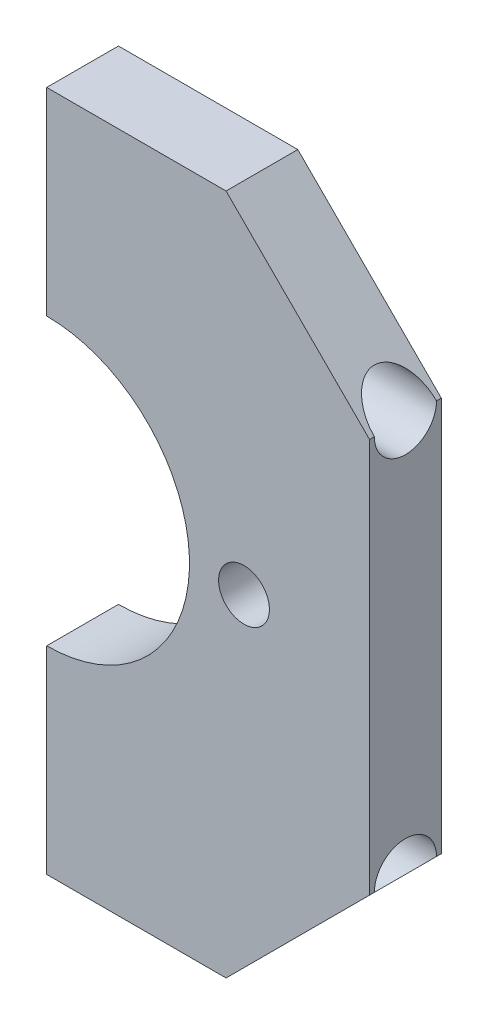
ISO-10303-21;
HEADER;
FILE_DESCRIPTION(('STEP AP214'),'2;1');
FILE_NAME('part.step','',(''),(''),'','','');
FILE_SCHEMA(('AUTOMOTIVE_DESIGN { 1 0 10303 214 1 1 1 1 }'));
ENDSEC;
DATA;
#1=APPLICATION_CONTEXT('core data for automotive mechanical design processes');
#2=APPLICATION_PROTOCOL_DEFINITION('international standard','automotive_design',2000,#1);
#3=PRODUCT_CONTEXT('',#1,'mechanical');
#4=PRODUCT('Part','Part','',(#3));
#5=PRODUCT_RELATED_PRODUCT_CATEGORY('part','',(#4));
#6=PRODUCT_DEFINITION_FORMATION('','',#4);
#7=PRODUCT_DEFINITION_CONTEXT('part definition',#1,'design');
#8=PRODUCT_DEFINITION('design','',#6,#7);
#9=PRODUCT_DEFINITION_SHAPE('','',#8);
#10=(LENGTH_UNIT() NAMED_UNIT(*) SI_UNIT(.MILLI.,.METRE.));
#11=(NAMED_UNIT(*) PLANE_ANGLE_UNIT() SI_UNIT($,.RADIAN.));
#12=(NAMED_UNIT(*) SI_UNIT($,.STERADIAN.) SOLID_ANGLE_UNIT());
#13=UNCERTAINTY_MEASURE_WITH_UNIT(LENGTH_MEASURE(1.E-05),#10,'distance_accuracy_value','');
#14=(GEOMETRIC_REPRESENTATION_CONTEXT(3) GLOBAL_UNCERTAINTY_ASSIGNED_CONTEXT((#13)) GLOBAL_UNIT_ASSIGNED_CONTEXT((#10,
#11,#12)) REPRESENTATION_CONTEXT('',''));
#15=CARTESIAN_POINT('',(0.,0.,0.));
#16=DIRECTION('',(0.,0.,1.));
#17=DIRECTION('',(1.,0.,0.));
#18=AXIS2_PLACEMENT_3D('',#15,#16,#17);
#19=CARTESIAN_POINT('',(57.15,-60.325,12.7));
#20=DIRECTION('',(-1.,0.,0.));
#21=DIRECTION('',(0.,0.,1.));
#22=AXIS2_PLACEMENT_3D('',#19,#20,#21);
#23=PLANE('',#22);
#24=CARTESIAN_POINT('',(57.15,34.925,6.35));
#25=DIRECTION('',(1.,0.,0.));
#26=DIRECTION('',(0.,0.,-1.));
#27=AXIS2_PLACEMENT_3D('',#24,#25,#26);
#28=CIRCLE('',#27,5.49910000000001);
#29=CARTESIAN_POINT('',(57.15,34.9249999999999,11.8491));
#30=VERTEX_POINT('',#29);
#31=CARTESIAN_POINT('',(57.15,34.9249999999999,0.850899999999991));
#32=VERTEX_POINT('',#31);
#33=EDGE_CURVE('E59',#30,#32,#28,.T.);
#34=ORIENTED_EDGE('',*,*,#33,.F.);
#35=DIRECTION('',(0.,0.,1.));
#36=VECTOR('',#35,1.);
#37=CARTESIAN_POINT('',(57.15,34.9249999999999,12.7));
#38=LINE('',#37,#36);
#39=CARTESIAN_POINT('',(57.15,34.9249999999999,12.7));
#40=VERTEX_POINT('',#39);
#41=EDGE_CURVE('E127',#30,#40,#38,.T.);
#42=ORIENTED_EDGE('',*,*,#41,.T.);
#43=DIRECTION('',(0.,1.,0.));
#44=VECTOR('',#43,1.);
#45=CARTESIAN_POINT('',(57.15,-60.325,12.7));
#46=LINE('',#45,#44);
#47=CARTESIAN_POINT('',(57.15,-34.9250000000001,12.7));
#48=VERTEX_POINT('',#47);
#49=EDGE_CURVE('E184',#48,#40,#46,.T.);
#50=ORIENTED_EDGE('',*,*,#49,.F.);
#51=DIRECTION('',(0.,0.,-1.));
#52=VECTOR('',#51,1.);
#53=CARTESIAN_POINT('',(57.15,-34.925,12.7));
#54=LINE('',#53,#52);
#55=CARTESIAN_POINT('',(57.15,-34.925,11.8491));
#56=VERTEX_POINT('',#55);
#57=EDGE_CURVE('E137',#48,#56,#54,.T.);
#58=ORIENTED_EDGE('',*,*,#57,.T.);
#59=CARTESIAN_POINT('',(57.15,-34.925,6.35));
#60=DIRECTION('',(1.,0.,0.));
#61=DIRECTION('',(0.,0.,-1.));
#62=AXIS2_PLACEMENT_3D('',#59,#60,#61);
#63=CIRCLE('',#62,5.49910000000001);
#64=CARTESIAN_POINT('',(57.15,-34.925,0.85089999999999));
#65=VERTEX_POINT('',#64);
#66=EDGE_CURVE('E66',#65,#56,#63,.T.);
#67=ORIENTED_EDGE('',*,*,#66,.F.);
#68=CARTESIAN_POINT('',(57.15,-34.925,0.));
#69=VERTEX_POINT('',#68);
#70=EDGE_CURVE('E141',#65,#69,#54,.T.);
#71=ORIENTED_EDGE('',*,*,#70,.T.);
#72=DIRECTION('',(0.,1.,0.));
#73=VECTOR('',#72,1.);
#74=CARTESIAN_POINT('',(57.15,-60.325,0.));
#75=LINE('',#74,#73);
#76=CARTESIAN_POINT('',(57.15,34.9249999999999,0.));
#77=VERTEX_POINT('',#76);
#78=EDGE_CURVE('E191',#69,#77,#75,.T.);
#79=ORIENTED_EDGE('',*,*,#78,.T.);
#80=EDGE_CURVE('E130',#77,#32,#38,.T.);
#81=ORIENTED_EDGE('',*,*,#80,.T.);
#82=EDGE_LOOP('',(#34,#42,#50,#58,#67,#71,#79,#81));
#83=FACE_BOUND('',#82,.T.);
#84=ADVANCED_FACE('F46',(#83),#23,.F.);
#85=CARTESIAN_POINT('',(0.,-60.325,12.7));
#86=DIRECTION('',(1.,0.,0.));
#87=DIRECTION('',(0.,0.,-1.));
#88=AXIS2_PLACEMENT_3D('',#85,#86,#87);
#89=PLANE('',#88);
#90=CARTESIAN_POINT('',(0.,34.925,6.35));
#91=DIRECTION('',(1.,0.,0.));
#92=DIRECTION('',(0.,0.,-1.));
#93=AXIS2_PLACEMENT_3D('',#90,#91,#92);
#94=CIRCLE('',#93,3.30200000000001);
#95=CARTESIAN_POINT('',(0.,34.925,3.04799999999999));
#96=VERTEX_POINT('',#95);
#97=EDGE_CURVE('E161',#96,#96,#94,.T.);
#98=ORIENTED_EDGE('',*,*,#97,.T.);
#99=EDGE_LOOP('',(#98));
#100=FACE_BOUND('',#99,.T.);
#101=DIRECTION('',(0.,-1.,0.));
#102=VECTOR('',#101,1.);
#103=CARTESIAN_POINT('',(0.,-60.325,0.));
#104=LINE('',#103,#102);
#105=CARTESIAN_POINT('',(0.,60.325,0.));
#106=VERTEX_POINT('',#105);
#107=CARTESIAN_POINT('',(0.,25.273,0.));
#108=VERTEX_POINT('',#107);
#109=EDGE_CURVE('E185',#106,#108,#104,.T.);
#110=ORIENTED_EDGE('',*,*,#109,.T.);
#111=DIRECTION('',(0.,0.,1.));
#112=VECTOR('',#111,1.);
#113=CARTESIAN_POINT('',(0.,25.273,0.));
#114=LINE('',#113,#112);
#115=CARTESIAN_POINT('',(0.,25.273,12.7));
#116=VERTEX_POINT('',#115);
#117=EDGE_CURVE('E152',#108,#116,#114,.T.);
#118=ORIENTED_EDGE('',*,*,#117,.T.);
#119=DIRECTION('',(0.,-1.,0.));
#120=VECTOR('',#119,1.);
#121=CARTESIAN_POINT('',(0.,-60.325,12.7));
#122=LINE('',#121,#120);
#123=CARTESIAN_POINT('',(0.,60.325,12.7));
#124=VERTEX_POINT('',#123);
#125=EDGE_CURVE('E196',#124,#116,#122,.T.);
#126=ORIENTED_EDGE('',*,*,#125,.F.);
#127=DIRECTION('',(0.,0.,-1.));
#128=VECTOR('',#127,1.);
#129=CARTESIAN_POINT('',(0.,60.325,12.7));
#130=LINE('',#129,#128);
#131=EDGE_CURVE('E174',#124,#106,#130,.T.);
#132=ORIENTED_EDGE('',*,*,#131,.T.);
#133=EDGE_LOOP('',(#110,#118,#126,#132));
#134=FACE_BOUND('',#133,.T.);
#135=ADVANCED_FACE('F239',(#100,#134),#89,.F.);
#136=CARTESIAN_POINT('',(57.15,60.325,12.7));
#137=DIRECTION('',(0.,0.,1.));
#138=DIRECTION('',(1.,0.,0.));
#139=AXIS2_PLACEMENT_3D('',#136,#137,#138);
#140=PLANE('',#139);
#141=CARTESIAN_POINT('',(0.,0.,12.7));
#142=DIRECTION('',(0.,0.,1.));
#143=DIRECTION('',(1.,0.,0.));
#144=AXIS2_PLACEMENT_3D('',#141,#142,#143);
#145=CIRCLE('',#144,25.273);
#146=CARTESIAN_POINT('',(0.,-25.273,12.7));
#147=VERTEX_POINT('',#146);
#148=EDGE_CURVE('E209',#147,#116,#145,.T.);
#149=ORIENTED_EDGE('',*,*,#148,.F.);
#150=CARTESIAN_POINT('',(0.,-60.325,12.7));
#151=VERTEX_POINT('',#150);
#152=EDGE_CURVE('E199',#147,#151,#122,.T.);
#153=ORIENTED_EDGE('',*,*,#152,.T.);
#154=DIRECTION('',(1.,0.,0.));
#155=VECTOR('',#154,1.);
#156=CARTESIAN_POINT('',(57.15,-60.325,12.7));
#157=LINE('',#156,#155);
#158=CARTESIAN_POINT('',(31.7499999999999,-60.325,12.7));
#159=VERTEX_POINT('',#158);
#160=EDGE_CURVE('E180',#151,#159,#157,.T.);
#161=ORIENTED_EDGE('',*,*,#160,.T.);
#162=DIRECTION('',(-0.707106781186549,-0.707106781186546,0.));
#163=VECTOR('',#162,1.);
#164=CARTESIAN_POINT('',(104.775,12.6999999999998,12.7));
#165=LINE('',#164,#163);
#166=EDGE_CURVE('E139',#159,#48,#165,.F.);
#167=ORIENTED_EDGE('',*,*,#166,.T.);
#168=ORIENTED_EDGE('',*,*,#49,.T.);
#169=DIRECTION('',(0.707106781186546,-0.707106781186549,0.));
#170=VECTOR('',#169,1.);
#171=CARTESIAN_POINT('',(44.45,47.625,12.7));
#172=LINE('',#171,#170);
#173=CARTESIAN_POINT('',(31.75,60.325,12.7));
#174=VERTEX_POINT('',#173);
#175=EDGE_CURVE('E136',#40,#174,#172,.F.);
#176=ORIENTED_EDGE('',*,*,#175,.T.);
#177=DIRECTION('',(-1.,0.,0.));
#178=VECTOR('',#177,1.);
#179=CARTESIAN_POINT('',(57.15,60.325,12.7));
#180=LINE('',#179,#178);
#181=EDGE_CURVE('E200',#174,#124,#180,.T.);
#182=ORIENTED_EDGE('',*,*,#181,.T.);
#183=ORIENTED_EDGE('',*,*,#125,.T.);
#184=EDGE_LOOP('',(#149,#153,#161,#167,#168,#176,#182,#183));
#185=FACE_BOUND('',#184,.T.);
#186=CARTESIAN_POINT('',(34.925,0.,12.7));
#187=DIRECTION('',(0.,0.,1.));
#188=DIRECTION('',(1.,0.,0.));
#189=AXIS2_PLACEMENT_3D('',#186,#187,#188);
#190=CIRCLE('',#189,4.4958);
#191=CARTESIAN_POINT('',(39.4208,0.,12.7));
#192=VERTEX_POINT('',#191);
#193=EDGE_CURVE('E193',#192,#192,#190,.T.);
#194=ORIENTED_EDGE('',*,*,#193,.F.);
#195=EDGE_LOOP('',(#194));
#196=FACE_BOUND('',#195,.T.);
#197=ADVANCED_FACE('F244',(#185,#196),#140,.T.);
#198=CARTESIAN_POINT('',(57.15,60.325,0.));
#199=DIRECTION('',(0.,0.,1.));
#200=DIRECTION('',(1.,0.,0.));
#201=AXIS2_PLACEMENT_3D('',#198,#199,#200);
#202=PLANE('',#201);
#203=CARTESIAN_POINT('',(0.,-25.273,0.));
#204=VERTEX_POINT('',#203);
#205=CARTESIAN_POINT('',(0.,-60.325,0.));
#206=VERTEX_POINT('',#205);
#207=EDGE_CURVE('E188',#204,#206,#104,.T.);
#208=ORIENTED_EDGE('',*,*,#207,.F.);
#209=CARTESIAN_POINT('',(0.,0.,0.));
#210=DIRECTION('',(0.,0.,1.));
#211=DIRECTION('',(1.,0.,0.));
#212=AXIS2_PLACEMENT_3D('',#209,#210,#211);
#213=CIRCLE('',#212,25.273);
#214=EDGE_CURVE('E206',#204,#108,#213,.T.);
#215=ORIENTED_EDGE('',*,*,#214,.T.);
#216=ORIENTED_EDGE('',*,*,#109,.F.);
#217=DIRECTION('',(-1.,0.,0.));
#218=VECTOR('',#217,1.);
#219=CARTESIAN_POINT('',(57.15,60.325,0.));
#220=LINE('',#219,#218);
#221=CARTESIAN_POINT('',(31.75,60.325,0.));
#222=VERTEX_POINT('',#221);
#223=EDGE_CURVE('E189',#222,#106,#220,.T.);
#224=ORIENTED_EDGE('',*,*,#223,.F.);
#225=DIRECTION('',(-0.707106781186546,0.707106781186549,0.));
#226=VECTOR('',#225,1.);
#227=CARTESIAN_POINT('',(31.75,60.325,0.));
#228=LINE('',#227,#226);
#229=EDGE_CURVE('E166',#222,#77,#228,.F.);
#230=ORIENTED_EDGE('',*,*,#229,.T.);
#231=ORIENTED_EDGE('',*,*,#78,.F.);
#232=DIRECTION('',(0.707106781186549,0.707106781186546,0.));
#233=VECTOR('',#232,1.);
#234=CARTESIAN_POINT('',(57.15,-34.925,0.));
#235=LINE('',#234,#233);
#236=CARTESIAN_POINT('',(31.7499999999999,-60.325,0.));
#237=VERTEX_POINT('',#236);
#238=EDGE_CURVE('E164',#69,#237,#235,.F.);
#239=ORIENTED_EDGE('',*,*,#238,.T.);
#240=DIRECTION('',(1.,0.,0.));
#241=VECTOR('',#240,1.);
#242=CARTESIAN_POINT('',(57.15,-60.325,0.));
#243=LINE('',#242,#241);
#244=EDGE_CURVE('E181',#206,#237,#243,.T.);
#245=ORIENTED_EDGE('',*,*,#244,.F.);
#246=EDGE_LOOP('',(#208,#215,#216,#224,#230,#231,#239,#245));
#247=FACE_BOUND('',#246,.T.);
#248=CARTESIAN_POINT('',(34.925,0.,0.));
#249=DIRECTION('',(0.,0.,1.));
#250=DIRECTION('',(1.,0.,0.));
#251=AXIS2_PLACEMENT_3D('',#248,#249,#250);
#252=CIRCLE('',#251,4.4958);
#253=CARTESIAN_POINT('',(39.4208,0.,0.));
#254=VERTEX_POINT('',#253);
#255=EDGE_CURVE('E203',#254,#254,#252,.T.);
#256=ORIENTED_EDGE('',*,*,#255,.T.);
#257=EDGE_LOOP('',(#256));
#258=FACE_BOUND('',#257,.T.);
#259=ADVANCED_FACE('F271',(#247,#258),#202,.F.);
#260=CARTESIAN_POINT('',(57.15,60.325,12.7));
#261=DIRECTION('',(0.,-1.,0.));
#262=DIRECTION('',(1.,0.,0.));
#263=AXIS2_PLACEMENT_3D('',#260,#261,#262);
#264=PLANE('',#263);
#265=ORIENTED_EDGE('',*,*,#181,.F.);
#266=DIRECTION('',(0.,0.,-1.));
#267=VECTOR('',#266,1.);
#268=CARTESIAN_POINT('',(31.75,60.325,12.7));
#269=LINE('',#268,#267);
#270=EDGE_CURVE('E169',#174,#222,#269,.T.);
#271=ORIENTED_EDGE('',*,*,#270,.T.);
#272=ORIENTED_EDGE('',*,*,#223,.T.);
#273=ORIENTED_EDGE('',*,*,#131,.F.);
#274=EDGE_LOOP('',(#265,#271,#272,#273));
#275=FACE_BOUND('',#274,.T.);
#276=ADVANCED_FACE('F249',(#275),#264,.F.);
#277=CARTESIAN_POINT('',(0.,-34.925,6.35));
#278=DIRECTION('',(1.,0.,0.));
#279=DIRECTION('',(0.,0.,-1.));
#280=AXIS2_PLACEMENT_3D('',#277,#278,#279);
#281=CIRCLE('',#280,3.30200000000001);
#282=CARTESIAN_POINT('',(0.,-34.925,3.04799999999999));
#283=VERTEX_POINT('',#282);
#284=EDGE_CURVE('E211',#283,#283,#281,.T.);
#285=ORIENTED_EDGE('',*,*,#284,.T.);
#286=EDGE_LOOP('',(#285));
#287=FACE_BOUND('',#286,.T.);
#288=ORIENTED_EDGE('',*,*,#152,.F.);
#289=DIRECTION('',(0.,0.,1.));
#290=VECTOR('',#289,1.);
#291=CARTESIAN_POINT('',(0.,-25.273,0.));
#292=LINE('',#291,#290);
#293=EDGE_CURVE('E149',#147,#204,#292,.F.);
#294=ORIENTED_EDGE('',*,*,#293,.T.);
#295=ORIENTED_EDGE('',*,*,#207,.T.);
#296=DIRECTION('',(0.,0.,-1.));
#297=VECTOR('',#296,1.);
#298=CARTESIAN_POINT('',(0.,-60.325,12.7));
#299=LINE('',#298,#297);
#300=EDGE_CURVE('E177',#151,#206,#299,.T.);
#301=ORIENTED_EDGE('',*,*,#300,.F.);
#302=EDGE_LOOP('',(#288,#294,#295,#301));
#303=FACE_BOUND('',#302,.T.);
#304=ADVANCED_FACE('F247',(#287,#303),#89,.F.);
#305=CARTESIAN_POINT('',(57.15,-60.325,12.7));
#306=DIRECTION('',(0.,1.,0.));
#307=DIRECTION('',(-1.,0.,0.));
#308=AXIS2_PLACEMENT_3D('',#305,#306,#307);
#309=PLANE('',#308);
#310=ORIENTED_EDGE('',*,*,#244,.T.);
#311=DIRECTION('',(0.,0.,1.));
#312=VECTOR('',#311,1.);
#313=CARTESIAN_POINT('',(31.7499999999999,-60.325,12.7));
#314=LINE('',#313,#312);
#315=EDGE_CURVE('E147',#237,#159,#314,.T.);
#316=ORIENTED_EDGE('',*,*,#315,.T.);
#317=ORIENTED_EDGE('',*,*,#160,.F.);
#318=ORIENTED_EDGE('',*,*,#300,.T.);
#319=EDGE_LOOP('',(#310,#316,#317,#318));
#320=FACE_BOUND('',#319,.T.);
#321=ADVANCED_FACE('F257',(#320),#309,.F.);
#322=CARTESIAN_POINT('',(34.925,0.,12.7));
#323=DIRECTION('',(0.,0.,-1.));
#324=DIRECTION('',(-1.,0.,0.));
#325=AXIS2_PLACEMENT_3D('',#322,#323,#324);
#326=CYLINDRICAL_SURFACE('',#325,4.4958);
#327=ORIENTED_EDGE('',*,*,#193,.T.);
#328=EDGE_LOOP('',(#327));
#329=FACE_BOUND('',#328,.T.);
#330=ORIENTED_EDGE('',*,*,#255,.F.);
#331=EDGE_LOOP('',(#330));
#332=FACE_BOUND('',#331,.T.);
#333=ADVANCED_FACE('F251',(#329,#332),#326,.F.);
#334=CARTESIAN_POINT('',(31.75,60.325,12.7));
#335=DIRECTION('',(-0.707106781186549,-0.707106781186546,0.));
#336=DIRECTION('',(0.707106781186546,-0.707106781186549,0.));
#337=AXIS2_PLACEMENT_3D('',#334,#335,#336);
#338=PLANE('',#337);
#339=CARTESIAN_POINT('',(57.1499999999999,34.925,6.35));
#340=DIRECTION('',(-0.707106781186549,-0.707106781186546,0.));
#341=DIRECTION('',(0.707106781186546,-0.707106781186549,0.));
#342=AXIS2_PLACEMENT_3D('',#339,#340,#341);
#343=ELLIPSE('',#342,7.77690180084589,5.49910000000001);
#344=EDGE_CURVE('E13',#32,#30,#343,.F.);
#345=ORIENTED_EDGE('',*,*,#344,.F.);
#346=ORIENTED_EDGE('',*,*,#80,.F.);
#347=ORIENTED_EDGE('',*,*,#229,.F.);
#348=ORIENTED_EDGE('',*,*,#270,.F.);
#349=ORIENTED_EDGE('',*,*,#175,.F.);
#350=ORIENTED_EDGE('',*,*,#41,.F.);
#351=EDGE_LOOP('',(#345,#346,#347,#348,#349,#350));
#352=FACE_BOUND('',#351,.T.);
#353=ADVANCED_FACE('F134',(#352),#338,.F.);
#354=CARTESIAN_POINT('',(57.15,-34.925,12.7));
#355=DIRECTION('',(-0.707106781186546,0.707106781186549,0.));
#356=DIRECTION('',(-0.707106781186549,-0.707106781186546,0.));
#357=AXIS2_PLACEMENT_3D('',#354,#355,#356);
#358=PLANE('',#357);
#359=CARTESIAN_POINT('',(57.15,-34.925,6.35));
#360=DIRECTION('',(-0.707106781186546,0.707106781186549,0.));
#361=DIRECTION('',(0.707106781186549,0.707106781186546,0.));
#362=AXIS2_PLACEMENT_3D('',#359,#360,#361);
#363=ELLIPSE('',#362,7.77690180084592,5.49910000000001);
#364=EDGE_CURVE('E54',#56,#65,#363,.F.);
#365=ORIENTED_EDGE('',*,*,#364,.F.);
#366=ORIENTED_EDGE('',*,*,#57,.F.);
#367=ORIENTED_EDGE('',*,*,#166,.F.);
#368=ORIENTED_EDGE('',*,*,#315,.F.);
#369=ORIENTED_EDGE('',*,*,#238,.F.);
#370=ORIENTED_EDGE('',*,*,#70,.F.);
#371=EDGE_LOOP('',(#365,#366,#367,#368,#369,#370));
#372=FACE_BOUND('',#371,.T.);
#373=ADVANCED_FACE('F48',(#372),#358,.F.);
#374=CARTESIAN_POINT('',(0.,0.,0.));
#375=DIRECTION('',(0.,0.,1.));
#376=DIRECTION('',(1.,0.,0.));
#377=AXIS2_PLACEMENT_3D('',#374,#375,#376);
#378=CYLINDRICAL_SURFACE('',#377,25.273);
#379=ORIENTED_EDGE('',*,*,#214,.F.);
#380=ORIENTED_EDGE('',*,*,#293,.F.);
#381=ORIENTED_EDGE('',*,*,#148,.T.);
#382=ORIENTED_EDGE('',*,*,#117,.F.);
#383=EDGE_LOOP('',(#379,#380,#381,#382));
#384=FACE_BOUND('',#383,.T.);
#385=ADVANCED_FACE('F256',(#384),#378,.F.);
#386=CARTESIAN_POINT('',(57.15,-34.925,6.35));
#387=DIRECTION('',(1.,0.,0.));
#388=DIRECTION('',(0.,0.,-1.));
#389=AXIS2_PLACEMENT_3D('',#386,#387,#388);
#390=CYLINDRICAL_SURFACE('',#389,3.30200000000001);
#391=ORIENTED_EDGE('',*,*,#284,.F.);
#392=EDGE_LOOP('',(#391));
#393=FACE_BOUND('',#392,.T.);
#394=CARTESIAN_POINT('',(30.226,-34.925,6.35));
#395=DIRECTION('',(1.,0.,0.));
#396=DIRECTION('',(0.,0.,-1.));
#397=AXIS2_PLACEMENT_3D('',#394,#395,#396);
#398=CIRCLE('',#397,3.30200000000001);
#399=CARTESIAN_POINT('',(30.226,-34.925,3.04799999999999));
#400=VERTEX_POINT('',#399);
#401=EDGE_CURVE('E216',#400,#400,#398,.T.);
#402=ORIENTED_EDGE('',*,*,#401,.T.);
#403=EDGE_LOOP('',(#402));
#404=FACE_BOUND('',#403,.T.);
#405=ADVANCED_FACE('F299',(#393,#404),#390,.F.);
#406=CARTESIAN_POINT('',(30.226,-31.623,6.35));
#407=DIRECTION('',(-1.,0.,0.));
#408=DIRECTION('',(0.,0.,1.));
#409=AXIS2_PLACEMENT_3D('',#406,#407,#408);
#410=PLANE('',#409);
#411=ORIENTED_EDGE('',*,*,#401,.F.);
#412=EDGE_LOOP('',(#411));
#413=FACE_BOUND('',#412,.T.);
#414=CARTESIAN_POINT('',(30.226,-34.925,6.35));
#415=DIRECTION('',(1.,0.,0.));
#416=DIRECTION('',(0.,0.,-1.));
#417=AXIS2_PLACEMENT_3D('',#414,#415,#416);
#418=CIRCLE('',#417,5.49910000000001);
#419=CARTESIAN_POINT('',(30.226,-34.925,0.85089999999999));
#420=VERTEX_POINT('',#419);
#421=EDGE_CURVE('E160',#420,#420,#418,.T.);
#422=ORIENTED_EDGE('',*,*,#421,.T.);
#423=EDGE_LOOP('',(#422));
#424=FACE_BOUND('',#423,.T.);
#425=ADVANCED_FACE('F303',(#413,#424),#410,.F.);
#426=CARTESIAN_POINT('',(57.15,-34.925,6.35));
#427=DIRECTION('',(1.,0.,0.));
#428=DIRECTION('',(0.,0.,-1.));
#429=AXIS2_PLACEMENT_3D('',#426,#427,#428);
#430=CYLINDRICAL_SURFACE('',#429,5.49910000000001);
#431=ORIENTED_EDGE('',*,*,#364,.T.);
#432=ORIENTED_EDGE('',*,*,#66,.T.);
#433=EDGE_LOOP('',(#431,#432));
#434=FACE_BOUND('',#433,.T.);
#435=ORIENTED_EDGE('',*,*,#421,.F.);
#436=EDGE_LOOP('',(#435));
#437=FACE_BOUND('',#436,.T.);
#438=ADVANCED_FACE('F154',(#434,#437),#430,.F.);
#439=CARTESIAN_POINT('',(57.15,34.925,6.35));
#440=DIRECTION('',(1.,0.,0.));
#441=DIRECTION('',(0.,0.,-1.));
#442=AXIS2_PLACEMENT_3D('',#439,#440,#441);
#443=CYLINDRICAL_SURFACE('',#442,3.30200000000001);
#444=ORIENTED_EDGE('',*,*,#97,.F.);
#445=EDGE_LOOP('',(#444));
#446=FACE_BOUND('',#445,.T.);
#447=CARTESIAN_POINT('',(30.226,34.925,6.35));
#448=DIRECTION('',(1.,0.,0.));
#449=DIRECTION('',(0.,0.,-1.));
#450=AXIS2_PLACEMENT_3D('',#447,#448,#449);
#451=CIRCLE('',#450,3.30200000000001);
#452=CARTESIAN_POINT('',(30.226,34.925,3.04799999999999));
#453=VERTEX_POINT('',#452);
#454=EDGE_CURVE('E223',#453,#453,#451,.T.);
#455=ORIENTED_EDGE('',*,*,#454,.T.);
#456=EDGE_LOOP('',(#455));
#457=FACE_BOUND('',#456,.T.);
#458=ADVANCED_FACE('F235',(#446,#457),#443,.F.);
#459=CARTESIAN_POINT('',(30.226,38.227,6.35));
#460=DIRECTION('',(-1.,0.,0.));
#461=DIRECTION('',(0.,0.,1.));
#462=AXIS2_PLACEMENT_3D('',#459,#460,#461);
#463=PLANE('',#462);
#464=ORIENTED_EDGE('',*,*,#454,.F.);
#465=EDGE_LOOP('',(#464));
#466=FACE_BOUND('',#465,.T.);
#467=CARTESIAN_POINT('',(30.226,34.925,6.35));
#468=DIRECTION('',(1.,0.,0.));
#469=DIRECTION('',(0.,0.,-1.));
#470=AXIS2_PLACEMENT_3D('',#467,#468,#469);
#471=CIRCLE('',#470,5.49910000000001);
#472=CARTESIAN_POINT('',(30.226,34.925,0.850899999999986));
#473=VERTEX_POINT('',#472);
#474=EDGE_CURVE('E131',#473,#473,#471,.T.);
#475=ORIENTED_EDGE('',*,*,#474,.T.);
#476=EDGE_LOOP('',(#475));
#477=FACE_BOUND('',#476,.T.);
#478=ADVANCED_FACE('F229',(#466,#477),#463,.F.);
#479=CARTESIAN_POINT('',(57.15,34.925,6.35));
#480=DIRECTION('',(1.,0.,0.));
#481=DIRECTION('',(0.,0.,-1.));
#482=AXIS2_PLACEMENT_3D('',#479,#480,#481);
#483=CYLINDRICAL_SURFACE('',#482,5.49910000000001);
#484=ORIENTED_EDGE('',*,*,#344,.T.);
#485=ORIENTED_EDGE('',*,*,#33,.T.);
#486=EDGE_LOOP('',(#484,#485));
#487=FACE_BOUND('',#486,.T.);
#488=ORIENTED_EDGE('',*,*,#474,.F.);
#489=EDGE_LOOP('',(#488));
#490=FACE_BOUND('',#489,.T.);
#491=ADVANCED_FACE('F119',(#487,#490),#483,.F.);
#492=CLOSED_SHELL('',(#84,#135,#197,#259,#276,#304,#321,#333,#353,#373,#385,#405,#425,#438,#458,
#478,#491));
#493=MANIFOLD_SOLID_BREP('B2',#492);
#494=ADVANCED_BREP_SHAPE_REPRESENTATION('',(#18,#493),#14);
#495=SHAPE_DEFINITION_REPRESENTATION(#9,#494);
ENDSEC;
END-ISO-10303-21;
